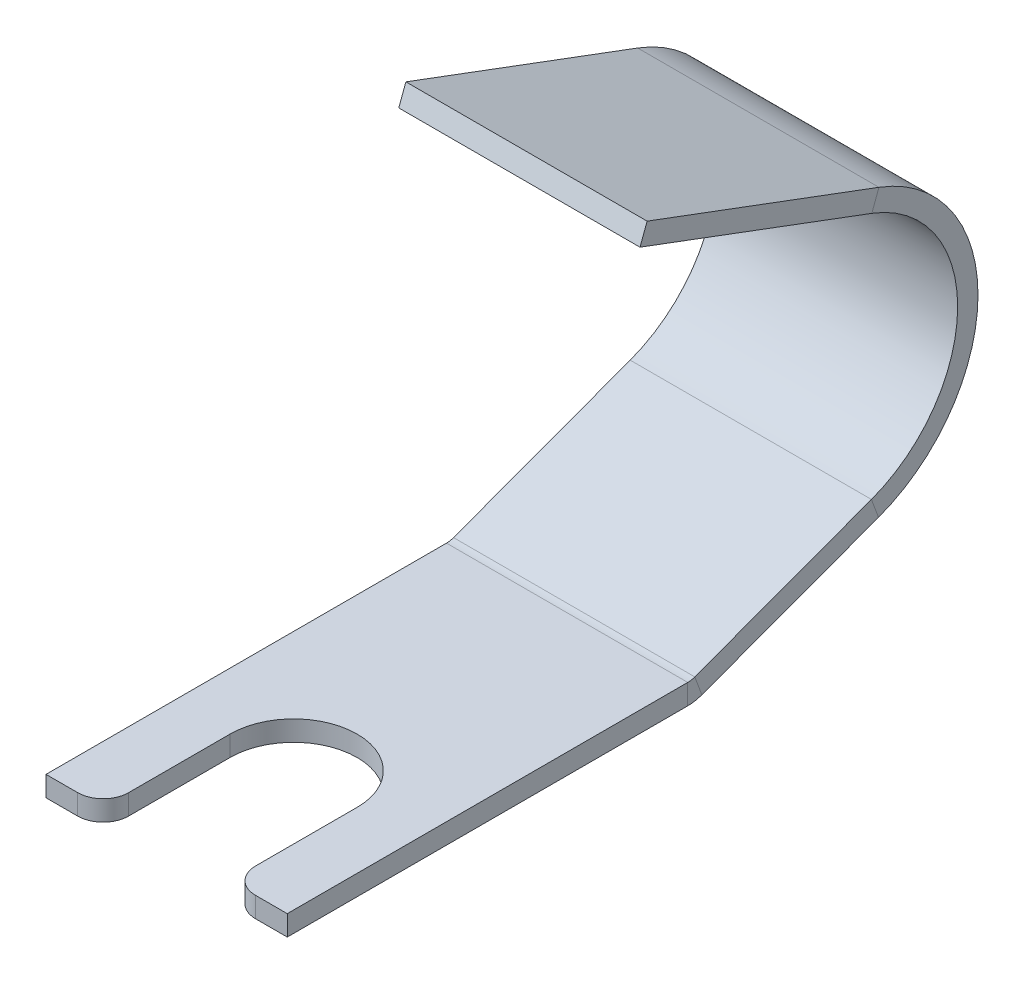
ISO-10303-21;
HEADER;
FILE_DESCRIPTION(('STEP AP214'),'2;1');
FILE_NAME('part.step','',(''),(''),'','','');
FILE_SCHEMA(('AUTOMOTIVE_DESIGN { 1 0 10303 214 1 1 1 1 }'));
ENDSEC;
DATA;
#1=APPLICATION_CONTEXT('core data for automotive mechanical design processes');
#2=APPLICATION_PROTOCOL_DEFINITION('international standard','automotive_design',2000,#1);
#3=PRODUCT_CONTEXT('',#1,'mechanical');
#4=PRODUCT('Part','Part','',(#3));
#5=PRODUCT_RELATED_PRODUCT_CATEGORY('part','',(#4));
#6=PRODUCT_DEFINITION_FORMATION('','',#4);
#7=PRODUCT_DEFINITION_CONTEXT('part definition',#1,'design');
#8=PRODUCT_DEFINITION('design','',#6,#7);
#9=PRODUCT_DEFINITION_SHAPE('','',#8);
#10=(LENGTH_UNIT() NAMED_UNIT(*) SI_UNIT(.MILLI.,.METRE.));
#11=(NAMED_UNIT(*) PLANE_ANGLE_UNIT() SI_UNIT($,.RADIAN.));
#12=(NAMED_UNIT(*) SI_UNIT($,.STERADIAN.) SOLID_ANGLE_UNIT());
#13=UNCERTAINTY_MEASURE_WITH_UNIT(LENGTH_MEASURE(1.E-05),#10,'distance_accuracy_value','');
#14=(GEOMETRIC_REPRESENTATION_CONTEXT(3) GLOBAL_UNCERTAINTY_ASSIGNED_CONTEXT((#13)) GLOBAL_UNIT_ASSIGNED_CONTEXT((#10,
#11,#12)) REPRESENTATION_CONTEXT('',''));
#15=CARTESIAN_POINT('',(0.,0.,0.));
#16=DIRECTION('',(0.,0.,1.));
#17=DIRECTION('',(1.,0.,0.));
#18=AXIS2_PLACEMENT_3D('',#15,#16,#17);
#19=CARTESIAN_POINT('',(47.5,-83.0000000000001,212.));
#20=DIRECTION('',(0.,0.,1.));
#21=DIRECTION('',(1.,0.,0.));
#22=AXIS2_PLACEMENT_3D('',#19,#20,#21);
#23=PLANE('',#22);
#24=DIRECTION('',(-1.,0.,0.));
#25=VECTOR('',#24,1.);
#26=CARTESIAN_POINT('',(47.5,-83.0000000000001,212.));
#27=LINE('',#26,#25);
#28=CARTESIAN_POINT('',(-35.,-83.,212.));
#29=VERTEX_POINT('',#28);
#30=CARTESIAN_POINT('',(-47.5,-83.,212.));
#31=VERTEX_POINT('',#30);
#32=EDGE_CURVE('E276',#29,#31,#27,.T.);
#33=ORIENTED_EDGE('',*,*,#32,.F.);
#34=DIRECTION('',(0.,-1.,0.));
#35=VECTOR('',#34,1.);
#36=CARTESIAN_POINT('',(-34.9999999999999,-75.,212.));
#37=LINE('',#36,#35);
#38=CARTESIAN_POINT('',(-34.9999999999999,-75.,212.));
#39=VERTEX_POINT('',#38);
#40=EDGE_CURVE('E322',#29,#39,#37,.F.);
#41=ORIENTED_EDGE('',*,*,#40,.T.);
#42=DIRECTION('',(-1.,0.,0.));
#43=VECTOR('',#42,1.);
#44=CARTESIAN_POINT('',(47.5000000000001,-75.0000000000001,212.));
#45=LINE('',#44,#43);
#46=CARTESIAN_POINT('',(-47.4999999999999,-75.,212.));
#47=VERTEX_POINT('',#46);
#48=EDGE_CURVE('E280',#39,#47,#45,.T.);
#49=ORIENTED_EDGE('',*,*,#48,.T.);
#50=DIRECTION('',(0.,1.,0.));
#51=VECTOR('',#50,1.);
#52=CARTESIAN_POINT('',(-47.5,-83.,212.));
#53=LINE('',#52,#51);
#54=EDGE_CURVE('E249',#31,#47,#53,.T.);
#55=ORIENTED_EDGE('',*,*,#54,.F.);
#56=EDGE_LOOP('',(#33,#41,#49,#55));
#57=FACE_BOUND('',#56,.T.);
#58=ADVANCED_FACE('F38',(#57),#23,.T.);
#59=CARTESIAN_POINT('',(47.5000000000004,-56.2730414759934,-20.8169354863078));
#60=DIRECTION('',(1.,0.,0.));
#61=DIRECTION('',(0.,0.,-1.));
#62=AXIS2_PLACEMENT_3D('',#59,#60,#61);
#63=PLANE('',#62);
#64=DIRECTION('',(0.,0.937884024599892,0.346948924771803));
#65=VECTOR('',#64,1.);
#66=CARTESIAN_POINT('',(47.5000000000004,-56.2730414759934,-20.8169354863078));
#67=LINE('',#66,#65);
#68=CARTESIAN_POINT('',(47.5000000000004,-56.2730414759934,-20.8169354863078));
#69=VERTEX_POINT('',#68);
#70=CARTESIAN_POINT('',(47.5000000000004,-48.7699692791944,-18.0413440881332));
#71=VERTEX_POINT('',#70);
#72=EDGE_CURVE('E315',#69,#71,#67,.T.);
#73=ORIENTED_EDGE('',*,*,#72,.F.);
#74=CARTESIAN_POINT('',(47.5,4.44089209850063E-13,0.));
#75=DIRECTION('',(1.,0.,0.));
#76=DIRECTION('',(0.,0.,-1.));
#77=AXIS2_PLACEMENT_3D('',#74,#75,#76);
#78=CIRCLE('',#77,60.);
#79=CARTESIAN_POINT('',(47.5000000000004,56.2070425934981,-20.9944841063717));
#80=VERTEX_POINT('',#79);
#81=EDGE_CURVE('E229',#69,#80,#78,.T.);
#82=ORIENTED_EDGE('',*,*,#81,.T.);
#83=DIRECTION('',(0.,0.936784043224967,-0.349908068439532));
#84=VECTOR('',#83,1.);
#85=CARTESIAN_POINT('',(47.5000000000004,48.7127702476983,-18.1952195588558));
#86=LINE('',#85,#84);
#87=CARTESIAN_POINT('',(47.5000000000004,48.7127702476983,-18.1952195588558));
#88=VERTEX_POINT('',#87);
#89=EDGE_CURVE('E313',#88,#80,#86,.T.);
#90=ORIENTED_EDGE('',*,*,#89,.F.);
#91=CARTESIAN_POINT('',(47.5,4.44089209850063E-13,0.));
#92=DIRECTION('',(1.,0.,0.));
#93=DIRECTION('',(0.,0.,-1.));
#94=AXIS2_PLACEMENT_3D('',#91,#92,#93);
#95=CIRCLE('',#94,52.);
#96=EDGE_CURVE('E205',#71,#88,#95,.T.);
#97=ORIENTED_EDGE('',*,*,#96,.F.);
#98=EDGE_LOOP('',(#73,#82,#90,#97));
#99=FACE_BOUND('',#98,.T.);
#100=ADVANCED_FACE('F401',(#99),#63,.T.);
#101=CARTESIAN_POINT('',(47.5000000000004,48.7127702476983,-18.1952195588558));
#102=DIRECTION('',(1.,0.,0.));
#103=DIRECTION('',(0.,0.,-1.));
#104=AXIS2_PLACEMENT_3D('',#101,#102,#103);
#105=PLANE('',#104);
#106=DIRECTION('',(0.,0.346948924771803,-0.937884024599891));
#107=VECTOR('',#106,1.);
#108=CARTESIAN_POINT('',(47.5,-83.0000000000001,51.4322794155584));
#109=LINE('',#108,#107);
#110=CARTESIAN_POINT('',(47.5,-82.0061443935983,48.7456554503272));
#111=VERTEX_POINT('',#110);
#112=EDGE_CURVE('E226',#111,#69,#109,.T.);
#113=ORIENTED_EDGE('',*,*,#112,.T.);
#114=ORIENTED_EDGE('',*,*,#72,.T.);
#115=DIRECTION('',(0.,0.346948924771803,-0.937884024599892));
#116=VECTOR('',#115,1.);
#117=CARTESIAN_POINT('',(47.5000000000004,-75.4969278032008,54.207870813733));
#118=LINE('',#117,#116);
#119=CARTESIAN_POINT('',(47.5000000000001,-74.5030721967991,51.5212468485009));
#120=VERTEX_POINT('',#119);
#121=EDGE_CURVE('E208',#120,#71,#118,.T.);
#122=ORIENTED_EDGE('',*,*,#121,.F.);
#123=DIRECTION('',(0.,-0.937884024599892,-0.346948924771803));
#124=VECTOR('',#123,1.);
#125=CARTESIAN_POINT('',(47.5000000000001,-74.5030721967991,51.5212468485009));
#126=LINE('',#125,#124);
#127=EDGE_CURVE('E305',#120,#111,#126,.T.);
#128=ORIENTED_EDGE('',*,*,#127,.T.);
#129=EDGE_LOOP('',(#113,#114,#122,#128));
#130=FACE_BOUND('',#129,.T.);
#131=ADVANCED_FACE('F404',(#130),#105,.T.);
#132=CARTESIAN_POINT('',(-47.4999999999995,56.207042593498,-20.9944841063715));
#133=DIRECTION('',(-1.,0.,0.));
#134=DIRECTION('',(0.,0.,1.));
#135=AXIS2_PLACEMENT_3D('',#132,#133,#134);
#136=PLANE('',#135);
#137=DIRECTION('',(0.,-0.936784043224967,0.349908068439532));
#138=VECTOR('',#137,1.);
#139=CARTESIAN_POINT('',(-47.4999999999995,56.207042593498,-20.9944841063715));
#140=LINE('',#139,#138);
#141=CARTESIAN_POINT('',(-47.4999999999995,56.207042593498,-20.9944841063715));
#142=VERTEX_POINT('',#141);
#143=CARTESIAN_POINT('',(-47.4999999999995,48.7127702476984,-18.1952195588556));
#144=VERTEX_POINT('',#143);
#145=EDGE_CURVE('E311',#142,#144,#140,.T.);
#146=ORIENTED_EDGE('',*,*,#145,.F.);
#147=CARTESIAN_POINT('',(-47.5,-4.44089209850063E-13,0.));
#148=DIRECTION('',(1.,0.,0.));
#149=DIRECTION('',(0.,0.,-1.));
#150=AXIS2_PLACEMENT_3D('',#147,#148,#149);
#151=CIRCLE('',#150,60.);
#152=CARTESIAN_POINT('',(-47.4999999999995,-56.2730414759935,-20.8169354863076));
#153=VERTEX_POINT('',#152);
#154=EDGE_CURVE('E261',#153,#142,#151,.T.);
#155=ORIENTED_EDGE('',*,*,#154,.F.);
#156=DIRECTION('',(0.,-0.937884024599892,-0.346948924771803));
#157=VECTOR('',#156,1.);
#158=CARTESIAN_POINT('',(-47.4999999999996,-48.7699692791943,-18.041344088133));
#159=LINE('',#158,#157);
#160=CARTESIAN_POINT('',(-47.4999999999996,-48.7699692791943,-18.041344088133));
#161=VERTEX_POINT('',#160);
#162=EDGE_CURVE('E309',#161,#153,#159,.T.);
#163=ORIENTED_EDGE('',*,*,#162,.F.);
#164=CARTESIAN_POINT('',(-47.5,-4.44089209850063E-13,0.));
#165=DIRECTION('',(1.,0.,0.));
#166=DIRECTION('',(0.,0.,-1.));
#167=AXIS2_PLACEMENT_3D('',#164,#165,#166);
#168=CIRCLE('',#167,52.);
#169=EDGE_CURVE('E237',#161,#144,#168,.T.);
#170=ORIENTED_EDGE('',*,*,#169,.T.);
#171=EDGE_LOOP('',(#146,#155,#163,#170));
#172=FACE_BOUND('',#171,.T.);
#173=ADVANCED_FACE('F377',(#172),#136,.T.);
#174=CARTESIAN_POINT('',(-47.4999999999996,-48.7699692791943,-18.041344088133));
#175=DIRECTION('',(-1.,0.,0.));
#176=DIRECTION('',(0.,0.,1.));
#177=AXIS2_PLACEMENT_3D('',#174,#175,#176);
#178=PLANE('',#177);
#179=DIRECTION('',(0.,0.349908068439531,0.936784043224967));
#180=VECTOR('',#179,1.);
#181=CARTESIAN_POINT('',(-47.5,87.5057276542002,62.7992645475164));
#182=LINE('',#181,#180);
#183=CARTESIAN_POINT('',(-47.4999999999996,90.3049922017165,70.293536893316));
#184=VERTEX_POINT('',#183);
#185=EDGE_CURVE('E199',#142,#184,#182,.T.);
#186=ORIENTED_EDGE('',*,*,#185,.F.);
#187=ORIENTED_EDGE('',*,*,#145,.T.);
#188=DIRECTION('',(0.,0.349908068439531,0.936784043224967));
#189=VECTOR('',#188,1.);
#190=CARTESIAN_POINT('',(-47.4999999999999,80.0114553084006,65.5985290950332));
#191=LINE('',#190,#189);
#192=CARTESIAN_POINT('',(-47.4999999999995,82.8107198559167,73.0928014408319));
#193=VERTEX_POINT('',#192);
#194=EDGE_CURVE('E235',#144,#193,#191,.T.);
#195=ORIENTED_EDGE('',*,*,#194,.T.);
#196=DIRECTION('',(0.,0.936784043224967,-0.34990806843953));
#197=VECTOR('',#196,1.);
#198=CARTESIAN_POINT('',(-47.4999999999995,82.8107198559167,73.0928014408319));
#199=LINE('',#198,#197);
#200=EDGE_CURVE('E195',#193,#184,#199,.T.);
#201=ORIENTED_EDGE('',*,*,#200,.T.);
#202=EDGE_LOOP('',(#186,#187,#195,#201));
#203=FACE_BOUND('',#202,.T.);
#204=ADVANCED_FACE('F381',(#203),#178,.T.);
#205=CARTESIAN_POINT('',(47.5000000000001,-83.0000000000001,54.2968382466755));
#206=DIRECTION('',(1.,0.,0.));
#207=DIRECTION('',(0.,0.,-1.));
#208=AXIS2_PLACEMENT_3D('',#205,#206,#207);
#209=PLANE('',#208);
#210=DIRECTION('',(0.,1.,0.));
#211=VECTOR('',#210,1.);
#212=CARTESIAN_POINT('',(47.5000000000001,-83.0000000000001,54.2968382466755));
#213=LINE('',#212,#211);
#214=CARTESIAN_POINT('',(47.5000000000001,-83.0000000000001,54.2968382466755));
#215=VERTEX_POINT('',#214);
#216=CARTESIAN_POINT('',(47.5000000000001,-75.0000000000001,54.2968382466755));
#217=VERTEX_POINT('',#216);
#218=EDGE_CURVE('E307',#215,#217,#213,.T.);
#219=ORIENTED_EDGE('',*,*,#218,.F.);
#220=CARTESIAN_POINT('',(47.5000000000001,-67.0000000000001,54.2968382466755));
#221=DIRECTION('',(-1.,0.,0.));
#222=DIRECTION('',(0.,0.,1.));
#223=AXIS2_PLACEMENT_3D('',#220,#221,#222);
#224=CIRCLE('',#223,16.);
#225=EDGE_CURVE('E223',#215,#111,#224,.F.);
#226=ORIENTED_EDGE('',*,*,#225,.T.);
#227=ORIENTED_EDGE('',*,*,#127,.F.);
#228=CARTESIAN_POINT('',(47.5000000000001,-67.0000000000001,54.2968382466755));
#229=DIRECTION('',(1.,0.,0.));
#230=DIRECTION('',(0.,0.,-1.));
#231=AXIS2_PLACEMENT_3D('',#228,#229,#230);
#232=CIRCLE('',#231,8.);
#233=EDGE_CURVE('E211',#217,#120,#232,.T.);
#234=ORIENTED_EDGE('',*,*,#233,.F.);
#235=EDGE_LOOP('',(#219,#226,#227,#234));
#236=FACE_BOUND('',#235,.T.);
#237=ADVANCED_FACE('F406',(#236),#209,.T.);
#238=CARTESIAN_POINT('',(47.5000000000001,-74.5030721967991,51.5212468485009));
#239=DIRECTION('',(1.,0.,0.));
#240=DIRECTION('',(0.,0.,-1.));
#241=AXIS2_PLACEMENT_3D('',#238,#239,#240);
#242=PLANE('',#241);
#243=DIRECTION('',(0.,0.,-1.));
#244=VECTOR('',#243,1.);
#245=CARTESIAN_POINT('',(47.5,-83.0000000000001,212.));
#246=LINE('',#245,#244);
#247=CARTESIAN_POINT('',(47.5,-83.0000000000001,212.));
#248=VERTEX_POINT('',#247);
#249=EDGE_CURVE('E220',#248,#215,#246,.T.);
#250=ORIENTED_EDGE('',*,*,#249,.T.);
#251=ORIENTED_EDGE('',*,*,#218,.T.);
#252=DIRECTION('',(0.,0.,-1.));
#253=VECTOR('',#252,1.);
#254=CARTESIAN_POINT('',(47.5000000000001,-75.0000000000001,212.));
#255=LINE('',#254,#253);
#256=CARTESIAN_POINT('',(47.5000000000001,-75.0000000000001,212.));
#257=VERTEX_POINT('',#256);
#258=EDGE_CURVE('E214',#257,#217,#255,.T.);
#259=ORIENTED_EDGE('',*,*,#258,.F.);
#260=DIRECTION('',(0.,1.,0.));
#261=VECTOR('',#260,1.);
#262=CARTESIAN_POINT('',(47.5,-83.0000000000001,212.));
#263=LINE('',#262,#261);
#264=EDGE_CURVE('E217',#248,#257,#263,.T.);
#265=ORIENTED_EDGE('',*,*,#264,.F.);
#266=EDGE_LOOP('',(#250,#251,#259,#265));
#267=FACE_BOUND('',#266,.T.);
#268=ADVANCED_FACE('F337',(#267),#242,.T.);
#269=CARTESIAN_POINT('',(-47.5,-82.0061443935982,48.7456554503272));
#270=DIRECTION('',(-1.,0.,0.));
#271=DIRECTION('',(0.,0.,1.));
#272=AXIS2_PLACEMENT_3D('',#269,#270,#271);
#273=PLANE('',#272);
#274=DIRECTION('',(0.,0.937884024599892,0.346948924771803));
#275=VECTOR('',#274,1.);
#276=CARTESIAN_POINT('',(-47.5,-82.0061443935982,48.7456554503272));
#277=LINE('',#276,#275);
#278=CARTESIAN_POINT('',(-47.5,-82.0061443935982,48.7456554503272));
#279=VERTEX_POINT('',#278);
#280=CARTESIAN_POINT('',(-47.4999999999999,-74.5030721967992,51.5212468485009));
#281=VERTEX_POINT('',#280);
#282=EDGE_CURVE('E303',#279,#281,#277,.T.);
#283=ORIENTED_EDGE('',*,*,#282,.F.);
#284=CARTESIAN_POINT('',(-47.4999999999996,-66.9999999999999,54.2968382466755));
#285=DIRECTION('',(-1.,0.,0.));
#286=DIRECTION('',(0.,0.,1.));
#287=AXIS2_PLACEMENT_3D('',#284,#285,#286);
#288=CIRCLE('',#287,16.);
#289=CARTESIAN_POINT('',(-47.4999999999996,-83.,54.2968382466755));
#290=VERTEX_POINT('',#289);
#291=EDGE_CURVE('E255',#290,#279,#288,.F.);
#292=ORIENTED_EDGE('',*,*,#291,.F.);
#293=DIRECTION('',(0.,-1.,0.));
#294=VECTOR('',#293,1.);
#295=CARTESIAN_POINT('',(-47.4999999999995,-75.,54.2968382466755));
#296=LINE('',#295,#294);
#297=CARTESIAN_POINT('',(-47.4999999999995,-75.,54.2968382466755));
#298=VERTEX_POINT('',#297);
#299=EDGE_CURVE('E301',#298,#290,#296,.T.);
#300=ORIENTED_EDGE('',*,*,#299,.F.);
#301=CARTESIAN_POINT('',(-47.4999999999996,-66.9999999999999,54.2968382466755));
#302=DIRECTION('',(1.,0.,0.));
#303=DIRECTION('',(0.,0.,-1.));
#304=AXIS2_PLACEMENT_3D('',#301,#302,#303);
#305=CIRCLE('',#304,8.);
#306=EDGE_CURVE('E243',#298,#281,#305,.T.);
#307=ORIENTED_EDGE('',*,*,#306,.T.);
#308=EDGE_LOOP('',(#283,#292,#300,#307));
#309=FACE_BOUND('',#308,.T.);
#310=ADVANCED_FACE('F363',(#309),#273,.T.);
#311=CARTESIAN_POINT('',(-47.4999999999995,-75.,54.2968382466755));
#312=DIRECTION('',(-1.,0.,0.));
#313=DIRECTION('',(0.,0.,1.));
#314=AXIS2_PLACEMENT_3D('',#311,#312,#313);
#315=PLANE('',#314);
#316=DIRECTION('',(0.,0.346948924771803,-0.937884024599891));
#317=VECTOR('',#316,1.);
#318=CARTESIAN_POINT('',(-47.5,-83.,51.4322794155584));
#319=LINE('',#318,#317);
#320=EDGE_CURVE('E258',#279,#153,#319,.T.);
#321=ORIENTED_EDGE('',*,*,#320,.F.);
#322=ORIENTED_EDGE('',*,*,#282,.T.);
#323=DIRECTION('',(0.,0.346948924771803,-0.937884024599892));
#324=VECTOR('',#323,1.);
#325=CARTESIAN_POINT('',(-47.4999999999995,-75.4969278032009,54.207870813733));
#326=LINE('',#325,#324);
#327=EDGE_CURVE('E240',#281,#161,#326,.T.);
#328=ORIENTED_EDGE('',*,*,#327,.T.);
#329=ORIENTED_EDGE('',*,*,#162,.T.);
#330=EDGE_LOOP('',(#321,#322,#328,#329));
#331=FACE_BOUND('',#330,.T.);
#332=ADVANCED_FACE('F366',(#331),#315,.T.);
#333=CARTESIAN_POINT('',(47.5000000000004,82.8107198559168,73.0928014408319));
#334=DIRECTION('',(0.,0.34990806843953,0.936784043224967));
#335=DIRECTION('',(0.,-0.936784043224967,0.34990806843953));
#336=AXIS2_PLACEMENT_3D('',#333,#334,#335);
#337=PLANE('',#336);
#338=ORIENTED_EDGE('',*,*,#200,.F.);
#339=DIRECTION('',(-1.,0.,0.));
#340=VECTOR('',#339,1.);
#341=CARTESIAN_POINT('',(47.5000000000004,82.8107198559168,73.0928014408319));
#342=LINE('',#341,#340);
#343=CARTESIAN_POINT('',(47.5000000000004,82.8107198559168,73.0928014408319));
#344=VERTEX_POINT('',#343);
#345=EDGE_CURVE('E295',#344,#193,#342,.T.);
#346=ORIENTED_EDGE('',*,*,#345,.F.);
#347=DIRECTION('',(0.,0.936784043224967,-0.34990806843953));
#348=VECTOR('',#347,1.);
#349=CARTESIAN_POINT('',(47.5000000000004,82.8107198559168,73.0928014408319));
#350=LINE('',#349,#348);
#351=CARTESIAN_POINT('',(47.5,90.3049922017164,70.293536893316));
#352=VERTEX_POINT('',#351);
#353=EDGE_CURVE('E198',#344,#352,#350,.T.);
#354=ORIENTED_EDGE('',*,*,#353,.T.);
#355=DIRECTION('',(-1.,0.,0.));
#356=VECTOR('',#355,1.);
#357=CARTESIAN_POINT('',(47.5,90.3049922017164,70.293536893316));
#358=LINE('',#357,#356);
#359=EDGE_CURVE('E298',#352,#184,#358,.T.);
#360=ORIENTED_EDGE('',*,*,#359,.T.);
#361=EDGE_LOOP('',(#338,#346,#354,#360));
#362=FACE_BOUND('',#361,.T.);
#363=ADVANCED_FACE('F394',(#362),#337,.T.);
#364=CARTESIAN_POINT('',(47.5000000000001,80.0114553084005,65.5985290950332));
#365=DIRECTION('',(0.,-0.936784043224967,0.349908068439531));
#366=DIRECTION('',(0.,-0.349908068439531,-0.936784043224967));
#367=AXIS2_PLACEMENT_3D('',#364,#365,#366);
#368=PLANE('',#367);
#369=ORIENTED_EDGE('',*,*,#194,.F.);
#370=DIRECTION('',(-1.,0.,0.));
#371=VECTOR('',#370,1.);
#372=CARTESIAN_POINT('',(47.5000000000004,48.7127702476983,-18.1952195588558));
#373=LINE('',#372,#371);
#374=EDGE_CURVE('E292',#88,#144,#373,.T.);
#375=ORIENTED_EDGE('',*,*,#374,.F.);
#376=DIRECTION('',(0.,0.34990806843953,0.936784043224967));
#377=VECTOR('',#376,1.);
#378=CARTESIAN_POINT('',(47.5000000000001,80.0114553084005,65.5985290950332));
#379=LINE('',#378,#377);
#380=EDGE_CURVE('E202',#88,#344,#379,.T.);
#381=ORIENTED_EDGE('',*,*,#380,.T.);
#382=ORIENTED_EDGE('',*,*,#345,.T.);
#383=EDGE_LOOP('',(#369,#375,#381,#382));
#384=FACE_BOUND('',#383,.T.);
#385=ADVANCED_FACE('F389',(#384),#368,.T.);
#386=CARTESIAN_POINT('',(47.5,4.44089209850063E-13,0.));
#387=DIRECTION('',(-1.,0.,0.));
#388=DIRECTION('',(0.,0.,1.));
#389=AXIS2_PLACEMENT_3D('',#386,#387,#388);
#390=CYLINDRICAL_SURFACE('',#389,52.);
#391=ORIENTED_EDGE('',*,*,#169,.F.);
#392=DIRECTION('',(-1.,0.,0.));
#393=VECTOR('',#392,1.);
#394=CARTESIAN_POINT('',(47.5000000000004,-48.7699692791944,-18.0413440881332));
#395=LINE('',#394,#393);
#396=EDGE_CURVE('E289',#71,#161,#395,.T.);
#397=ORIENTED_EDGE('',*,*,#396,.F.);
#398=ORIENTED_EDGE('',*,*,#96,.T.);
#399=ORIENTED_EDGE('',*,*,#374,.T.);
#400=EDGE_LOOP('',(#391,#397,#398,#399));
#401=FACE_BOUND('',#400,.T.);
#402=ADVANCED_FACE('F385',(#401),#390,.F.);
#403=CARTESIAN_POINT('',(47.5000000000004,-75.4969278032008,54.207870813733));
#404=DIRECTION('',(0.,0.937884024599892,0.346948924771803));
#405=DIRECTION('',(0.,-0.346948924771803,0.937884024599892));
#406=AXIS2_PLACEMENT_3D('',#403,#404,#405);
#407=PLANE('',#406);
#408=ORIENTED_EDGE('',*,*,#327,.F.);
#409=DIRECTION('',(-1.,0.,0.));
#410=VECTOR('',#409,1.);
#411=CARTESIAN_POINT('',(47.5000000000001,-74.5030721967991,51.5212468485009));
#412=LINE('',#411,#410);
#413=EDGE_CURVE('E286',#120,#281,#412,.T.);
#414=ORIENTED_EDGE('',*,*,#413,.F.);
#415=ORIENTED_EDGE('',*,*,#121,.T.);
#416=ORIENTED_EDGE('',*,*,#396,.T.);
#417=EDGE_LOOP('',(#408,#414,#415,#416));
#418=FACE_BOUND('',#417,.T.);
#419=ADVANCED_FACE('F431',(#418),#407,.T.);
#420=CARTESIAN_POINT('',(47.5000000000001,-67.0000000000001,54.2968382466755));
#421=DIRECTION('',(-1.,0.,0.));
#422=DIRECTION('',(0.,0.,1.));
#423=AXIS2_PLACEMENT_3D('',#420,#421,#422);
#424=CYLINDRICAL_SURFACE('',#423,8.);
#425=ORIENTED_EDGE('',*,*,#306,.F.);
#426=DIRECTION('',(-1.,0.,0.));
#427=VECTOR('',#426,1.);
#428=CARTESIAN_POINT('',(47.5000000000001,-75.0000000000001,54.2968382466755));
#429=LINE('',#428,#427);
#430=EDGE_CURVE('E283',#217,#298,#429,.T.);
#431=ORIENTED_EDGE('',*,*,#430,.F.);
#432=ORIENTED_EDGE('',*,*,#233,.T.);
#433=ORIENTED_EDGE('',*,*,#413,.T.);
#434=EDGE_LOOP('',(#425,#431,#432,#433));
#435=FACE_BOUND('',#434,.T.);
#436=ADVANCED_FACE('F345',(#435),#424,.F.);
#437=CARTESIAN_POINT('',(47.5000000000001,-75.0000000000001,212.));
#438=DIRECTION('',(0.,1.,0.));
#439=DIRECTION('',(0.,0.,1.));
#440=AXIS2_PLACEMENT_3D('',#437,#438,#439);
#441=PLANE('',#440);
#442=ORIENTED_EDGE('',*,*,#48,.F.);
#443=CARTESIAN_POINT('',(-34.9999999999996,-75.,202.));
#444=DIRECTION('',(0.,1.,0.));
#445=DIRECTION('',(0.,0.,1.));
#446=AXIS2_PLACEMENT_3D('',#443,#444,#445);
#447=CIRCLE('',#446,10.);
#448=CARTESIAN_POINT('',(-24.9999999999996,-74.9999999999996,202.000000000001));
#449=VERTEX_POINT('',#448);
#450=EDGE_CURVE('E325',#39,#449,#447,.T.);
#451=ORIENTED_EDGE('',*,*,#450,.T.);
#452=DIRECTION('',(0.,0.,1.));
#453=VECTOR('',#452,1.);
#454=CARTESIAN_POINT('',(-24.9999999999999,-74.9999999999996,212.000000000001));
#455=LINE('',#454,#453);
#456=CARTESIAN_POINT('',(-24.9999999999999,-74.9999999999996,162.000000000001));
#457=VERTEX_POINT('',#456);
#458=EDGE_CURVE('E192',#457,#449,#455,.T.);
#459=ORIENTED_EDGE('',*,*,#458,.F.);
#460=CARTESIAN_POINT('',(1.2490009027033E-13,-75.,162.));
#461=DIRECTION('',(0.,1.,0.));
#462=DIRECTION('',(0.,0.,1.));
#463=AXIS2_PLACEMENT_3D('',#460,#461,#462);
#464=CIRCLE('',#463,25.);
#465=CARTESIAN_POINT('',(25.0000000000001,-75.0000000000004,162.000000000001));
#466=VERTEX_POINT('',#465);
#467=EDGE_CURVE('E182',#466,#457,#464,.T.);
#468=ORIENTED_EDGE('',*,*,#467,.F.);
#469=DIRECTION('',(0.,0.,-1.));
#470=VECTOR('',#469,1.);
#471=CARTESIAN_POINT('',(25.0000000000001,-75.0000000000004,212.000000000001));
#472=LINE('',#471,#470);
#473=CARTESIAN_POINT('',(25.0000000000005,-75.0000000000004,202.000000000001));
#474=VERTEX_POINT('',#473);
#475=EDGE_CURVE('E183',#474,#466,#472,.T.);
#476=ORIENTED_EDGE('',*,*,#475,.F.);
#477=CARTESIAN_POINT('',(35.0000000000005,-75.,202.));
#478=DIRECTION('',(0.,1.,0.));
#479=DIRECTION('',(0.,0.,1.));
#480=AXIS2_PLACEMENT_3D('',#477,#478,#479);
#481=CIRCLE('',#480,10.);
#482=CARTESIAN_POINT('',(35.0000000000001,-75.,212.));
#483=VERTEX_POINT('',#482);
#484=EDGE_CURVE('E53',#474,#483,#481,.T.);
#485=ORIENTED_EDGE('',*,*,#484,.T.);
#486=EDGE_CURVE('E281',#257,#483,#45,.T.);
#487=ORIENTED_EDGE('',*,*,#486,.F.);
#488=ORIENTED_EDGE('',*,*,#258,.T.);
#489=ORIENTED_EDGE('',*,*,#430,.T.);
#490=DIRECTION('',(0.,0.,-1.));
#491=VECTOR('',#490,1.);
#492=CARTESIAN_POINT('',(-47.4999999999999,-75.,212.));
#493=LINE('',#492,#491);
#494=EDGE_CURVE('E246',#47,#298,#493,.T.);
#495=ORIENTED_EDGE('',*,*,#494,.F.);
#496=EDGE_LOOP('',(#442,#451,#459,#468,#476,#485,#487,#488,#489,#495));
#497=FACE_BOUND('',#496,.T.);
#498=ADVANCED_FACE('F340',(#497),#441,.T.);
#499=ORIENTED_EDGE('',*,*,#486,.T.);
#500=DIRECTION('',(0.,-1.,0.));
#501=VECTOR('',#500,1.);
#502=CARTESIAN_POINT('',(35.,-83.,212.));
#503=LINE('',#502,#501);
#504=CARTESIAN_POINT('',(35.,-83.,212.));
#505=VERTEX_POINT('',#504);
#506=EDGE_CURVE('E46',#483,#505,#503,.T.);
#507=ORIENTED_EDGE('',*,*,#506,.T.);
#508=EDGE_CURVE('E277',#248,#505,#27,.T.);
#509=ORIENTED_EDGE('',*,*,#508,.F.);
#510=ORIENTED_EDGE('',*,*,#264,.T.);
#511=EDGE_LOOP('',(#499,#507,#509,#510));
#512=FACE_BOUND('',#511,.T.);
#513=ADVANCED_FACE('F329',(#512),#23,.T.);
#514=CARTESIAN_POINT('',(47.5,-83.0000000000001,212.));
#515=DIRECTION('',(0.,1.,0.));
#516=DIRECTION('',(0.,0.,1.));
#517=AXIS2_PLACEMENT_3D('',#514,#515,#516);
#518=PLANE('',#517);
#519=DIRECTION('',(0.,0.,-1.));
#520=VECTOR('',#519,1.);
#521=CARTESIAN_POINT('',(-25.,-82.9999999999996,162.000000000001));
#522=LINE('',#521,#520);
#523=CARTESIAN_POINT('',(-24.9999999999996,-82.9999999999996,202.000000000001));
#524=VERTEX_POINT('',#523);
#525=CARTESIAN_POINT('',(-25.,-82.9999999999996,162.000000000001));
#526=VERTEX_POINT('',#525);
#527=EDGE_CURVE('E163',#524,#526,#522,.T.);
#528=ORIENTED_EDGE('',*,*,#527,.F.);
#529=CARTESIAN_POINT('',(-34.9999999999996,-83.,202.));
#530=DIRECTION('',(0.,1.,0.));
#531=DIRECTION('',(0.,0.,1.));
#532=AXIS2_PLACEMENT_3D('',#529,#530,#531);
#533=CIRCLE('',#532,10.);
#534=EDGE_CURVE('E320',#524,#29,#533,.F.);
#535=ORIENTED_EDGE('',*,*,#534,.T.);
#536=ORIENTED_EDGE('',*,*,#32,.T.);
#537=DIRECTION('',(0.,0.,-1.));
#538=VECTOR('',#537,1.);
#539=CARTESIAN_POINT('',(-47.5,-83.,212.));
#540=LINE('',#539,#538);
#541=EDGE_CURVE('E252',#31,#290,#540,.T.);
#542=ORIENTED_EDGE('',*,*,#541,.T.);
#543=DIRECTION('',(-1.,0.,0.));
#544=VECTOR('',#543,1.);
#545=CARTESIAN_POINT('',(47.5000000000001,-83.0000000000001,54.2968382466755));
#546=LINE('',#545,#544);
#547=EDGE_CURVE('E273',#215,#290,#546,.T.);
#548=ORIENTED_EDGE('',*,*,#547,.F.);
#549=ORIENTED_EDGE('',*,*,#249,.F.);
#550=ORIENTED_EDGE('',*,*,#508,.T.);
#551=CARTESIAN_POINT('',(35.0000000000005,-83.,202.));
#552=DIRECTION('',(0.,1.,0.));
#553=DIRECTION('',(0.,0.,1.));
#554=AXIS2_PLACEMENT_3D('',#551,#552,#553);
#555=CIRCLE('',#554,10.);
#556=CARTESIAN_POINT('',(25.0000000000005,-83.0000000000004,202.000000000001));
#557=VERTEX_POINT('',#556);
#558=EDGE_CURVE('E318',#505,#557,#555,.F.);
#559=ORIENTED_EDGE('',*,*,#558,.T.);
#560=DIRECTION('',(0.,0.,1.));
#561=VECTOR('',#560,1.);
#562=CARTESIAN_POINT('',(25.,-83.0000000000004,162.000000000001));
#563=LINE('',#562,#561);
#564=CARTESIAN_POINT('',(25.,-83.0000000000004,162.000000000001));
#565=VERTEX_POINT('',#564);
#566=EDGE_CURVE('E174',#565,#557,#563,.T.);
#567=ORIENTED_EDGE('',*,*,#566,.F.);
#568=CARTESIAN_POINT('',(0.,-83.,162.));
#569=DIRECTION('',(0.,-1.,0.));
#570=DIRECTION('',(0.,0.,-1.));
#571=AXIS2_PLACEMENT_3D('',#568,#569,#570);
#572=CIRCLE('',#571,25.);
#573=EDGE_CURVE('E179',#526,#565,#572,.T.);
#574=ORIENTED_EDGE('',*,*,#573,.F.);
#575=EDGE_LOOP('',(#528,#535,#536,#542,#548,#549,#550,#559,#567,#574));
#576=FACE_BOUND('',#575,.T.);
#577=ADVANCED_FACE('F186',(#576),#518,.F.);
#578=CARTESIAN_POINT('',(47.5000000000001,-67.0000000000001,54.2968382466755));
#579=DIRECTION('',(-1.,0.,0.));
#580=DIRECTION('',(0.,0.,1.));
#581=AXIS2_PLACEMENT_3D('',#578,#579,#580);
#582=CYLINDRICAL_SURFACE('',#581,16.);
#583=ORIENTED_EDGE('',*,*,#291,.T.);
#584=DIRECTION('',(-1.,0.,0.));
#585=VECTOR('',#584,1.);
#586=CARTESIAN_POINT('',(47.5,-82.0061443935983,48.7456554503272));
#587=LINE('',#586,#585);
#588=EDGE_CURVE('E270',#111,#279,#587,.T.);
#589=ORIENTED_EDGE('',*,*,#588,.F.);
#590=ORIENTED_EDGE('',*,*,#225,.F.);
#591=ORIENTED_EDGE('',*,*,#547,.T.);
#592=EDGE_LOOP('',(#583,#589,#590,#591));
#593=FACE_BOUND('',#592,.T.);
#594=ADVANCED_FACE('F361',(#593),#582,.T.);
#595=CARTESIAN_POINT('',(47.5,-83.0000000000001,51.4322794155584));
#596=DIRECTION('',(0.,0.937884024599891,0.346948924771803));
#597=DIRECTION('',(0.,-0.346948924771803,0.937884024599892));
#598=AXIS2_PLACEMENT_3D('',#595,#596,#597);
#599=PLANE('',#598);
#600=ORIENTED_EDGE('',*,*,#320,.T.);
#601=DIRECTION('',(-1.,0.,0.));
#602=VECTOR('',#601,1.);
#603=CARTESIAN_POINT('',(47.5000000000004,-56.2730414759934,-20.8169354863078));
#604=LINE('',#603,#602);
#605=EDGE_CURVE('E267',#69,#153,#604,.T.);
#606=ORIENTED_EDGE('',*,*,#605,.F.);
#607=ORIENTED_EDGE('',*,*,#112,.F.);
#608=ORIENTED_EDGE('',*,*,#588,.T.);
#609=EDGE_LOOP('',(#600,#606,#607,#608));
#610=FACE_BOUND('',#609,.T.);
#611=ADVANCED_FACE('F369',(#610),#599,.F.);
#612=CARTESIAN_POINT('',(47.5,4.44089209850063E-13,0.));
#613=DIRECTION('',(-1.,0.,0.));
#614=DIRECTION('',(0.,0.,1.));
#615=AXIS2_PLACEMENT_3D('',#612,#613,#614);
#616=CYLINDRICAL_SURFACE('',#615,60.);
#617=ORIENTED_EDGE('',*,*,#154,.T.);
#618=DIRECTION('',(-1.,0.,0.));
#619=VECTOR('',#618,1.);
#620=CARTESIAN_POINT('',(47.5000000000004,56.2070425934981,-20.9944841063717));
#621=LINE('',#620,#619);
#622=EDGE_CURVE('E232',#80,#142,#621,.T.);
#623=ORIENTED_EDGE('',*,*,#622,.F.);
#624=ORIENTED_EDGE('',*,*,#81,.F.);
#625=ORIENTED_EDGE('',*,*,#605,.T.);
#626=EDGE_LOOP('',(#617,#623,#624,#625));
#627=FACE_BOUND('',#626,.T.);
#628=ADVANCED_FACE('F374',(#627),#616,.T.);
#629=CARTESIAN_POINT('',(47.5,87.5057276542003,62.7992645475155));
#630=DIRECTION('',(0.,-0.936784043224967,0.349908068439531));
#631=DIRECTION('',(0.,-0.349908068439531,-0.936784043224967));
#632=AXIS2_PLACEMENT_3D('',#629,#630,#631);
#633=PLANE('',#632);
#634=ORIENTED_EDGE('',*,*,#185,.T.);
#635=ORIENTED_EDGE('',*,*,#359,.F.);
#636=DIRECTION('',(0.,0.34990806843953,0.936784043224967));
#637=VECTOR('',#636,1.);
#638=CARTESIAN_POINT('',(47.5,87.5057276542003,62.7992645475155));
#639=LINE('',#638,#637);
#640=EDGE_CURVE('E196',#80,#352,#639,.T.);
#641=ORIENTED_EDGE('',*,*,#640,.F.);
#642=ORIENTED_EDGE('',*,*,#622,.T.);
#643=EDGE_LOOP('',(#634,#635,#641,#642));
#644=FACE_BOUND('',#643,.T.);
#645=ADVANCED_FACE('F398',(#644),#633,.F.);
#646=CARTESIAN_POINT('',(47.5,4.44089209850063E-13,0.));
#647=DIRECTION('',(1.,0.,0.));
#648=DIRECTION('',(0.,0.,-1.));
#649=AXIS2_PLACEMENT_3D('',#646,#647,#648);
#650=PLANE('',#649);
#651=ORIENTED_EDGE('',*,*,#640,.T.);
#652=ORIENTED_EDGE('',*,*,#353,.F.);
#653=ORIENTED_EDGE('',*,*,#380,.F.);
#654=ORIENTED_EDGE('',*,*,#89,.T.);
#655=EDGE_LOOP('',(#651,#652,#653,#654));
#656=FACE_BOUND('',#655,.T.);
#657=ADVANCED_FACE('F529',(#656),#650,.T.);
#658=CARTESIAN_POINT('',(-47.5,-4.44089209850063E-13,0.));
#659=DIRECTION('',(1.,0.,0.));
#660=DIRECTION('',(0.,0.,-1.));
#661=AXIS2_PLACEMENT_3D('',#658,#659,#660);
#662=PLANE('',#661);
#663=ORIENTED_EDGE('',*,*,#494,.T.);
#664=ORIENTED_EDGE('',*,*,#299,.T.);
#665=ORIENTED_EDGE('',*,*,#541,.F.);
#666=ORIENTED_EDGE('',*,*,#54,.T.);
#667=EDGE_LOOP('',(#663,#664,#665,#666));
#668=FACE_BOUND('',#667,.T.);
#669=ADVANCED_FACE('F350',(#668),#662,.F.);
#670=CARTESIAN_POINT('',(0.,90.3049922017165,162.));
#671=DIRECTION('',(0.,-1.,0.));
#672=DIRECTION('',(0.,0.,-1.));
#673=AXIS2_PLACEMENT_3D('',#670,#671,#672);
#674=CYLINDRICAL_SURFACE('',#673,25.);
#675=ORIENTED_EDGE('',*,*,#467,.T.);
#676=DIRECTION('',(0.,-1.,0.));
#677=VECTOR('',#676,1.);
#678=CARTESIAN_POINT('',(-25.,90.3049922017168,162.000000000001));
#679=LINE('',#678,#677);
#680=EDGE_CURVE('E167',#457,#526,#679,.T.);
#681=ORIENTED_EDGE('',*,*,#680,.T.);
#682=ORIENTED_EDGE('',*,*,#573,.T.);
#683=DIRECTION('',(0.,-1.,0.));
#684=VECTOR('',#683,1.);
#685=CARTESIAN_POINT('',(25.,90.3049922017161,162.000000000001));
#686=LINE('',#685,#684);
#687=EDGE_CURVE('E173',#466,#565,#686,.T.);
#688=ORIENTED_EDGE('',*,*,#687,.F.);
#689=EDGE_LOOP('',(#675,#681,#682,#688));
#690=FACE_BOUND('',#689,.T.);
#691=ADVANCED_FACE('F177',(#690),#674,.F.);
#692=CARTESIAN_POINT('',(-25.,90.3049922017168,162.000000000001));
#693=DIRECTION('',(-1.,0.,0.));
#694=DIRECTION('',(0.,0.,1.));
#695=AXIS2_PLACEMENT_3D('',#692,#693,#694);
#696=PLANE('',#695);
#697=ORIENTED_EDGE('',*,*,#458,.T.);
#698=DIRECTION('',(0.,-1.,0.));
#699=VECTOR('',#698,1.);
#700=CARTESIAN_POINT('',(-24.9999999999996,-82.9999999999996,202.000000000001));
#701=LINE('',#700,#699);
#702=EDGE_CURVE('E170',#449,#524,#701,.T.);
#703=ORIENTED_EDGE('',*,*,#702,.T.);
#704=ORIENTED_EDGE('',*,*,#527,.T.);
#705=ORIENTED_EDGE('',*,*,#680,.F.);
#706=EDGE_LOOP('',(#697,#703,#704,#705));
#707=FACE_BOUND('',#706,.T.);
#708=ADVANCED_FACE('F166',(#707),#696,.F.);
#709=CARTESIAN_POINT('',(25.,90.3049922017161,162.000000000001));
#710=DIRECTION('',(1.,0.,0.));
#711=DIRECTION('',(0.,0.,-1.));
#712=AXIS2_PLACEMENT_3D('',#709,#710,#711);
#713=PLANE('',#712);
#714=ORIENTED_EDGE('',*,*,#566,.T.);
#715=DIRECTION('',(0.,-1.,0.));
#716=VECTOR('',#715,1.);
#717=CARTESIAN_POINT('',(25.0000000000005,-75.0000000000004,202.000000000001));
#718=LINE('',#717,#716);
#719=EDGE_CURVE('E11',#557,#474,#718,.F.);
#720=ORIENTED_EDGE('',*,*,#719,.T.);
#721=ORIENTED_EDGE('',*,*,#475,.T.);
#722=ORIENTED_EDGE('',*,*,#687,.T.);
#723=EDGE_LOOP('',(#714,#720,#721,#722));
#724=FACE_BOUND('',#723,.T.);
#725=ADVANCED_FACE('F566',(#724),#713,.F.);
#726=CARTESIAN_POINT('',(-34.9999999999996,90.3049922017165,202.));
#727=DIRECTION('',(0.,1.,0.));
#728=DIRECTION('',(0.,0.,1.));
#729=AXIS2_PLACEMENT_3D('',#726,#727,#728);
#730=CYLINDRICAL_SURFACE('',#729,10.);
#731=ORIENTED_EDGE('',*,*,#450,.F.);
#732=ORIENTED_EDGE('',*,*,#40,.F.);
#733=ORIENTED_EDGE('',*,*,#534,.F.);
#734=ORIENTED_EDGE('',*,*,#702,.F.);
#735=EDGE_LOOP('',(#731,#732,#733,#734));
#736=FACE_BOUND('',#735,.T.);
#737=ADVANCED_FACE('F358',(#736),#730,.T.);
#738=CARTESIAN_POINT('',(35.0000000000005,-83.,202.));
#739=DIRECTION('',(0.,1.,0.));
#740=DIRECTION('',(0.,0.,1.));
#741=AXIS2_PLACEMENT_3D('',#738,#739,#740);
#742=CYLINDRICAL_SURFACE('',#741,10.);
#743=ORIENTED_EDGE('',*,*,#484,.F.);
#744=ORIENTED_EDGE('',*,*,#719,.F.);
#745=ORIENTED_EDGE('',*,*,#558,.F.);
#746=ORIENTED_EDGE('',*,*,#506,.F.);
#747=EDGE_LOOP('',(#743,#744,#745,#746));
#748=FACE_BOUND('',#747,.T.);
#749=ADVANCED_FACE('F40',(#748),#742,.T.);
#750=CLOSED_SHELL('',(#58,#100,#131,#173,#204,#237,#268,#310,#332,#363,#385,#402,#419,#436,#498,
#513,#577,#594,#611,#628,#645,#657,#669,#691,#708,#725,#737,#749));
#751=MANIFOLD_SOLID_BREP('B2',#750);
#752=ADVANCED_BREP_SHAPE_REPRESENTATION('',(#18,#751),#14);
#753=SHAPE_DEFINITION_REPRESENTATION(#9,#752);
ENDSEC;
END-ISO-10303-21;
